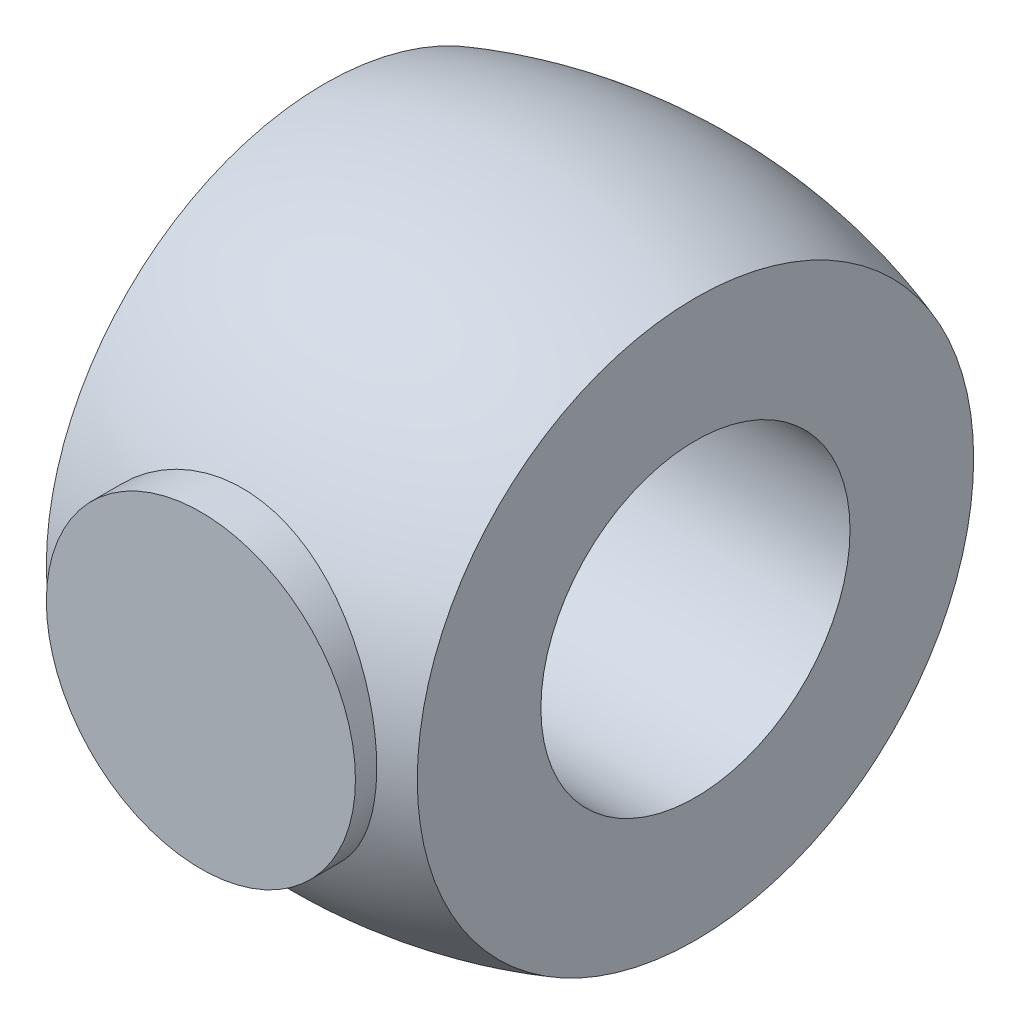
ISO-10303-21;
HEADER;
FILE_DESCRIPTION(('STEP AP214'),'2;1');
FILE_NAME('part.step','',(''),(''),'','','');
FILE_SCHEMA(('AUTOMOTIVE_DESIGN { 1 0 10303 214 1 1 1 1 }'));
ENDSEC;
DATA;
#1=APPLICATION_CONTEXT('core data for automotive mechanical design processes');
#2=APPLICATION_PROTOCOL_DEFINITION('international standard','automotive_design',2000,#1);
#3=PRODUCT_CONTEXT('',#1,'mechanical');
#4=PRODUCT('Part','Part','',(#3));
#5=PRODUCT_RELATED_PRODUCT_CATEGORY('part','',(#4));
#6=PRODUCT_DEFINITION_FORMATION('','',#4);
#7=PRODUCT_DEFINITION_CONTEXT('part definition',#1,'design');
#8=PRODUCT_DEFINITION('design','',#6,#7);
#9=PRODUCT_DEFINITION_SHAPE('','',#8);
#10=(LENGTH_UNIT() NAMED_UNIT(*) SI_UNIT(.MILLI.,.METRE.));
#11=(NAMED_UNIT(*) PLANE_ANGLE_UNIT() SI_UNIT($,.RADIAN.));
#12=(NAMED_UNIT(*) SI_UNIT($,.STERADIAN.) SOLID_ANGLE_UNIT());
#13=UNCERTAINTY_MEASURE_WITH_UNIT(LENGTH_MEASURE(1.E-05),#10,'distance_accuracy_value','');
#14=(GEOMETRIC_REPRESENTATION_CONTEXT(3) GLOBAL_UNCERTAINTY_ASSIGNED_CONTEXT((#13)) GLOBAL_UNIT_ASSIGNED_CONTEXT((#10,
#11,#12)) REPRESENTATION_CONTEXT('',''));
#15=CARTESIAN_POINT('',(0.,0.,0.));
#16=DIRECTION('',(0.,0.,1.));
#17=DIRECTION('',(1.,0.,0.));
#18=AXIS2_PLACEMENT_3D('',#15,#16,#17);
#19=CARTESIAN_POINT('',(0.,0.,10.));
#20=DIRECTION('',(0.,0.,1.));
#21=DIRECTION('',(1.,0.,0.));
#22=AXIS2_PLACEMENT_3D('',#19,#20,#21);
#23=PLANE('',#22);
#24=CARTESIAN_POINT('',(0.,0.,9.99999999999091));
#25=DIRECTION('',(0.,0.,1.));
#26=DIRECTION('',(1.,0.,0.));
#27=AXIS2_PLACEMENT_3D('',#24,#25,#26);
#28=CIRCLE('',#27,5.);
#29=CARTESIAN_POINT('',(5.,0.,9.99999999999091));
#30=VERTEX_POINT('',#29);
#31=EDGE_CURVE('E36',#30,#30,#28,.F.);
#32=ORIENTED_EDGE('',*,*,#31,.F.);
#33=EDGE_LOOP('',(#32));
#34=FACE_BOUND('',#33,.T.);
#35=ADVANCED_FACE('F31',(#34),#23,.T.);
#36=CARTESIAN_POINT('',(-6.,0.,0.));
#37=DIRECTION('',(-1.,0.,0.));
#38=DIRECTION('',(0.,0.,1.));
#39=AXIS2_PLACEMENT_3D('',#36,#37,#38);
#40=CYLINDRICAL_SURFACE('',#39,5.);
#41=CARTESIAN_POINT('',(6.,0.,0.));
#42=DIRECTION('',(-1.,0.,0.));
#43=DIRECTION('',(0.,0.,1.));
#44=AXIS2_PLACEMENT_3D('',#41,#42,#43);
#45=CIRCLE('',#44,5.);
#46=CARTESIAN_POINT('',(6.,0.,5.));
#47=VERTEX_POINT('',#46);
#48=EDGE_CURVE('E74',#47,#47,#45,.T.);
#49=ORIENTED_EDGE('',*,*,#48,.F.);
#50=EDGE_LOOP('',(#49));
#51=FACE_BOUND('',#50,.T.);
#52=CARTESIAN_POINT('',(-6.,0.,0.));
#53=DIRECTION('',(-1.,0.,0.));
#54=DIRECTION('',(0.,0.,1.));
#55=AXIS2_PLACEMENT_3D('',#52,#53,#54);
#56=CIRCLE('',#55,5.);
#57=CARTESIAN_POINT('',(-6.,0.,5.));
#58=VERTEX_POINT('',#57);
#59=EDGE_CURVE('E44',#58,#58,#56,.T.);
#60=ORIENTED_EDGE('',*,*,#59,.T.);
#61=EDGE_LOOP('',(#60));
#62=FACE_BOUND('',#61,.T.);
#63=ADVANCED_FACE('F55',(#51,#62),#40,.F.);
#64=CARTESIAN_POINT('',(6.,5.,0.));
#65=DIRECTION('',(-1.,0.,0.));
#66=DIRECTION('',(0.,0.,1.));
#67=AXIS2_PLACEMENT_3D('',#64,#65,#66);
#68=PLANE('',#67);
#69=CARTESIAN_POINT('',(6.,0.,0.));
#70=DIRECTION('',(-1.,0.,0.));
#71=DIRECTION('',(0.,0.,1.));
#72=AXIS2_PLACEMENT_3D('',#69,#70,#71);
#73=CIRCLE('',#72,9.);
#74=CARTESIAN_POINT('',(6.,0.,9.));
#75=VERTEX_POINT('',#74);
#76=EDGE_CURVE('E72',#75,#75,#73,.T.);
#77=ORIENTED_EDGE('',*,*,#76,.F.);
#78=EDGE_LOOP('',(#77));
#79=FACE_BOUND('',#78,.T.);
#80=ORIENTED_EDGE('',*,*,#48,.T.);
#81=EDGE_LOOP('',(#80));
#82=FACE_BOUND('',#81,.T.);
#83=ADVANCED_FACE('F60',(#79,#82),#68,.F.);
#84=CARTESIAN_POINT('',(-6.,9.,0.));
#85=DIRECTION('',(1.,0.,0.));
#86=DIRECTION('',(0.,0.,-1.));
#87=AXIS2_PLACEMENT_3D('',#84,#85,#86);
#88=PLANE('',#87);
#89=ORIENTED_EDGE('',*,*,#59,.F.);
#90=EDGE_LOOP('',(#89));
#91=FACE_BOUND('',#90,.T.);
#92=CARTESIAN_POINT('',(-6.,0.,0.));
#93=DIRECTION('',(-1.,0.,0.));
#94=DIRECTION('',(0.,0.,1.));
#95=AXIS2_PLACEMENT_3D('',#92,#93,#94);
#96=CIRCLE('',#95,9.);
#97=CARTESIAN_POINT('',(-6.,0.,9.));
#98=VERTEX_POINT('',#97);
#99=EDGE_CURVE('E40',#98,#98,#96,.T.);
#100=ORIENTED_EDGE('',*,*,#99,.T.);
#101=EDGE_LOOP('',(#100));
#102=FACE_BOUND('',#101,.T.);
#103=ADVANCED_FACE('F52',(#91,#102),#88,.F.);
#104=CARTESIAN_POINT('',(0.,0.,0.));
#105=DIRECTION('',(-1.,0.,0.));
#106=DIRECTION('',(0.,0.,1.));
#107=AXIS2_PLACEMENT_3D('',#104,#105,#106);
#108=DEGENERATE_TOROIDAL_SURFACE('',#107,8.5,18.5,.F.);
#109=CARTESIAN_POINT('',(-3.23502209182863,-3.81243125385693,8.93564453977601));
#110=CARTESIAN_POINT('',(-3.02311818635013,-3.99223437992672,8.89984737328407));
#111=CARTESIAN_POINT('',(-2.79605684641708,-4.15446329059912,8.86491084890363));
#112=CARTESIAN_POINT('',(-2.31746090009242,-4.43925163804318,8.80064594491822));
#113=CARTESIAN_POINT('',(-2.06591794743334,-4.56179748402409,8.77131948807253));
#114=CARTESIAN_POINT('',(-1.54481085121163,-4.76357851733348,8.72166394324605));
#115=CARTESIAN_POINT('',(-1.27522722033156,-4.84276599355693,8.70134477144992));
#116=CARTESIAN_POINT('',(-0.726042839105582,-4.95493364283615,8.67224209401942));
#117=CARTESIAN_POINT('',(-0.446444696718786,-4.98792575754992,8.66345560718355));
#118=CARTESIAN_POINT('',(0.108268400399126,-5.00635631328766,8.65856879770925));
#119=CARTESIAN_POINT('',(0.383347251373756,-4.99282146907019,8.66219456531723));
#120=CARTESIAN_POINT('',(0.927163031037183,-4.92093477161866,8.68108483639138));
#121=CARTESIAN_POINT('',(1.19589987921566,-4.86258234975052,8.69634948752874));
#122=CARTESIAN_POINT('',(1.71801421367626,-4.70345689451518,8.73658743090397));
#123=CARTESIAN_POINT('',(1.97147018169093,-4.60292638006976,8.76150515731924));
#124=CARTESIAN_POINT('',(2.4581204913464,-4.36249198597732,8.81824785607641));
#125=CARTESIAN_POINT('',(2.69131163445237,-4.22258190550499,8.85007391604465));
#126=CARTESIAN_POINT('',(3.13778625593101,-3.90279033390066,8.91814944701728));
#127=CARTESIAN_POINT('',(3.35033739619427,-3.72190705344454,8.95449718620119));
#128=CARTESIAN_POINT('',(3.74250485754056,-3.32731905782538,9.02691058677888));
#129=CARTESIAN_POINT('',(3.92211685177534,-3.11361003747655,9.06297621051945));
#130=CARTESIAN_POINT('',(4.24655560511079,-2.65464928611315,9.13156746571159));
#131=CARTESIAN_POINT('',(4.39068231824719,-2.40888998702494,9.16401584637282));
#132=CARTESIAN_POINT('',(4.63540981263284,-1.89571926968133,9.22093559319704));
#133=CARTESIAN_POINT('',(4.73601648591474,-1.62831078825958,9.24540803908449));
#134=CARTESIAN_POINT('',(4.88899276911042,-1.08447805099982,9.28322472498083));
#135=CARTESIAN_POINT('',(4.94219711878896,-0.80830233064327,9.29676112983374));
#136=CARTESIAN_POINT('',(5.00157724310634,-0.250636501267667,9.31189531296527));
#137=CARTESIAN_POINT('',(5.00776116052226,0.0308526791268125,9.31349515836016));
#138=CARTESIAN_POINT('',(4.97335117762408,0.583514008908222,9.304695371775));
#139=CARTESIAN_POINT('',(4.93394669808592,0.854766151387517,9.29460084199996));
#140=CARTESIAN_POINT('',(4.81162012883752,1.38664573017389,9.26400793550621));
#141=CARTESIAN_POINT('',(4.72869660559973,1.64727281618432,9.24350921607175));
#142=CARTESIAN_POINT('',(4.52137682881794,2.15221974279715,9.1941528484215));
#143=CARTESIAN_POINT('',(4.39676264276552,2.39644561956023,9.16525138216337));
#144=CARTESIAN_POINT('',(4.10976052608867,2.86084109393786,9.10215831913201));
#145=CARTESIAN_POINT('',(3.94736600358125,3.0810064836338,9.06796579952904));
#146=CARTESIAN_POINT('',(3.58399645585744,3.49764371257778,8.9968306711095));
#147=CARTESIAN_POINT('',(3.38206004431772,3.69326916566013,8.95983762980416));
#148=CARTESIAN_POINT('',(2.94805035211753,4.04815850436025,8.88805873778348));
#149=CARTESIAN_POINT('',(2.71597448093304,4.207419261138,8.8532730771783));
#150=CARTESIAN_POINT('',(2.22537965623371,4.48643064346659,8.78954656983278));
#151=CARTESIAN_POINT('',(1.96662751333861,4.60578589212955,8.76066525368687));
#152=CARTESIAN_POINT('',(1.43182059361695,4.79902938944939,8.71267853734746));
#153=CARTESIAN_POINT('',(1.15576948466823,4.87292724068117,8.69357107263618));
#154=CARTESIAN_POINT('',(0.601692596128598,4.97143049775864,8.66787752571475));
#155=CARTESIAN_POINT('',(0.323895266895416,4.99724081524223,8.66098558585456));
#156=CARTESIAN_POINT('',(-0.232135657775741,5.00233818485621,8.65963416549171));
#157=CARTESIAN_POINT('',(-0.510369193006017,4.98163117450362,8.66517309830027));
#158=CARTESIAN_POINT('',(-1.05322303939834,4.89537305626478,8.68774551357043));
#159=CARTESIAN_POINT('',(-1.31800678301537,4.83077899297258,8.70453358069715));
#160=CARTESIAN_POINT('',(-1.83292377982141,4.65982881645035,8.74739987222858));
#161=CARTESIAN_POINT('',(-2.08305548490585,4.5534682993752,8.77347907626168));
#162=CARTESIAN_POINT('',(-2.56628378074439,4.29998670166649,8.83252412283823));
#163=CARTESIAN_POINT('',(-2.79902202742724,4.15220858857378,8.86559866784902));
#164=CARTESIAN_POINT('',(-3.23686728970639,3.82074821306689,8.93473505257954));
#165=CARTESIAN_POINT('',(-3.44196932851387,3.63705949835122,8.97079742847118));
#166=CARTESIAN_POINT('',(-3.82474531622964,3.23279623114167,9.04309688096091));
#167=CARTESIAN_POINT('',(-4.0014770501957,3.01132374666031,9.07930993654759));
#168=CARTESIAN_POINT('',(-4.31533696515307,2.5412076251207,9.14683716208525));
#169=CARTESIAN_POINT('',(-4.45246578154056,2.29256442408245,9.17815141062986));
#170=CARTESIAN_POINT('',(-4.68261181581048,1.77564871381811,9.23229510043247));
#171=CARTESIAN_POINT('',(-4.77576126269434,1.50743788106357,9.255149930548));
#172=CARTESIAN_POINT('',(-4.91543493842214,0.958472946243994,9.28989628599751));
#173=CARTESIAN_POINT('',(-4.9619694687344,0.677721629842549,9.30179023353932));
#174=CARTESIAN_POINT('',(-5.0061522929932,0.120157941122927,9.31307939866097));
#175=CARTESIAN_POINT('',(-5.005144784971,-0.156541572101927,9.31281828977644));
#176=CARTESIAN_POINT('',(-4.95760861709665,-0.705748778796739,9.30068017713193));
#177=CARTESIAN_POINT('',(-4.91107888132648,-0.978256373036052,9.28880289882373));
#178=CARTESIAN_POINT('',(-4.77475587719913,-1.50863158649426,9.25490978479249));
#179=CARTESIAN_POINT('',(-4.68539409226089,-1.76661714275466,9.23299515949098));
#180=CARTESIAN_POINT('',(-4.46636118466011,-2.26393807474675,9.18137837493571));
#181=CARTESIAN_POINT('',(-4.33670046260071,-2.50327824268742,9.15167822532833));
#182=CARTESIAN_POINT('',(-4.05685842237372,-2.93262325751584,9.09105086952388));
#183=CARTESIAN_POINT('',(-3.9104363958145,-3.12516306778023,9.06060744717307));
#184=CARTESIAN_POINT('',(-3.59149216489907,-3.48702778482599,8.99844142180039));
#185=CARTESIAN_POINT('',(-3.41896793895041,-3.65635089155607,8.96671871983913));
#186=CARTESIAN_POINT('',(-3.23502209182863,-3.81243125385693,8.93564453977601));
#187=B_SPLINE_CURVE_WITH_KNOTS('',3,(#109,#110,#111,#112,#113,#114,#115,#116,#117,#118,#119,
#120,#121,#122,#123,#124,#125,#126,#127,#128,#129,#130,#131,#132,#133,#134,#135,#136,#137,#138,
#139,#140,#141,#142,#143,#144,#145,#146,#147,#148,#149,#150,#151,#152,#153,#154,#155,#156,#157,
#158,#159,#160,#161,#162,#163,#164,#165,#166,#167,#168,#169,#170,#171,#172,#173,#174,#175,#176,
#177,#178,#179,#180,#181,#182,#183,#184,#185,#186),.UNSPECIFIED.,.T.,.F.,(4,2,2,2,2,2,2,2,2,2,2,
2,2,2,2,2,2,2,2,2,2,2,2,2,2,2,2,2,2,2,2,2,2,2,2,2,2,2,4),(0.,0.839768389134094,1.6798240815624,
2.52080231436409,3.36156311127275,4.1838909578741,5.00622923813535,5.82390260633146,
6.64170479994341,7.48220918586916,8.32282390052247,9.17888943917694,10.0348390416794,
10.8753994082945,11.7158142073067,12.5347874401444,13.3537876518467,14.1771377721787,
15.0006316578662,15.8474197243403,16.6942806215302,17.5492992748751,18.4041372490971,
19.2372518364458,20.0702600902791,20.8856624410944,21.7011507908382,22.5303892252545,
23.359776791733,24.2126728975534,25.065555318598,25.915856859335,26.7659704497609,
27.5920628303527,28.4181747361127,29.2361340472855,30.0538824294273,30.7827974461665,
31.5117689456608),.UNSPECIFIED.);
#188=CARTESIAN_POINT('',(-3.23502209182863,-3.81243125385693,8.93564453977601));
#189=VERTEX_POINT('',#188);
#190=EDGE_CURVE('E10',#189,#189,#187,.T.);
#191=ORIENTED_EDGE('',*,*,#190,.F.);
#192=EDGE_LOOP('',(#191));
#193=FACE_BOUND('',#192,.T.);
#194=ORIENTED_EDGE('',*,*,#99,.F.);
#195=EDGE_LOOP('',(#194));
#196=FACE_BOUND('',#195,.T.);
#197=ORIENTED_EDGE('',*,*,#76,.T.);
#198=EDGE_LOOP('',(#197));
#199=FACE_BOUND('',#198,.T.);
#200=ADVANCED_FACE('F64',(#193,#196,#199),#108,.F.);
#201=CARTESIAN_POINT('',(0.,0.,-500000.));
#202=DIRECTION('',(0.,0.,1.));
#203=DIRECTION('',(1.,0.,0.));
#204=AXIS2_PLACEMENT_3D('',#201,#202,#203);
#205=CYLINDRICAL_SURFACE('',#204,5.);
#206=ORIENTED_EDGE('',*,*,#190,.T.);
#207=EDGE_LOOP('',(#206));
#208=FACE_BOUND('',#207,.T.);
#209=ORIENTED_EDGE('',*,*,#31,.T.);
#210=EDGE_LOOP('',(#209));
#211=FACE_BOUND('',#210,.T.);
#212=ADVANCED_FACE('F33',(#208,#211),#205,.T.);
#213=CLOSED_SHELL('',(#35,#63,#83,#103,#200,#212));
#214=MANIFOLD_SOLID_BREP('B2',#213);
#215=ADVANCED_BREP_SHAPE_REPRESENTATION('',(#18,#214),#14);
#216=SHAPE_DEFINITION_REPRESENTATION(#9,#215);
ENDSEC;
END-ISO-10303-21;
